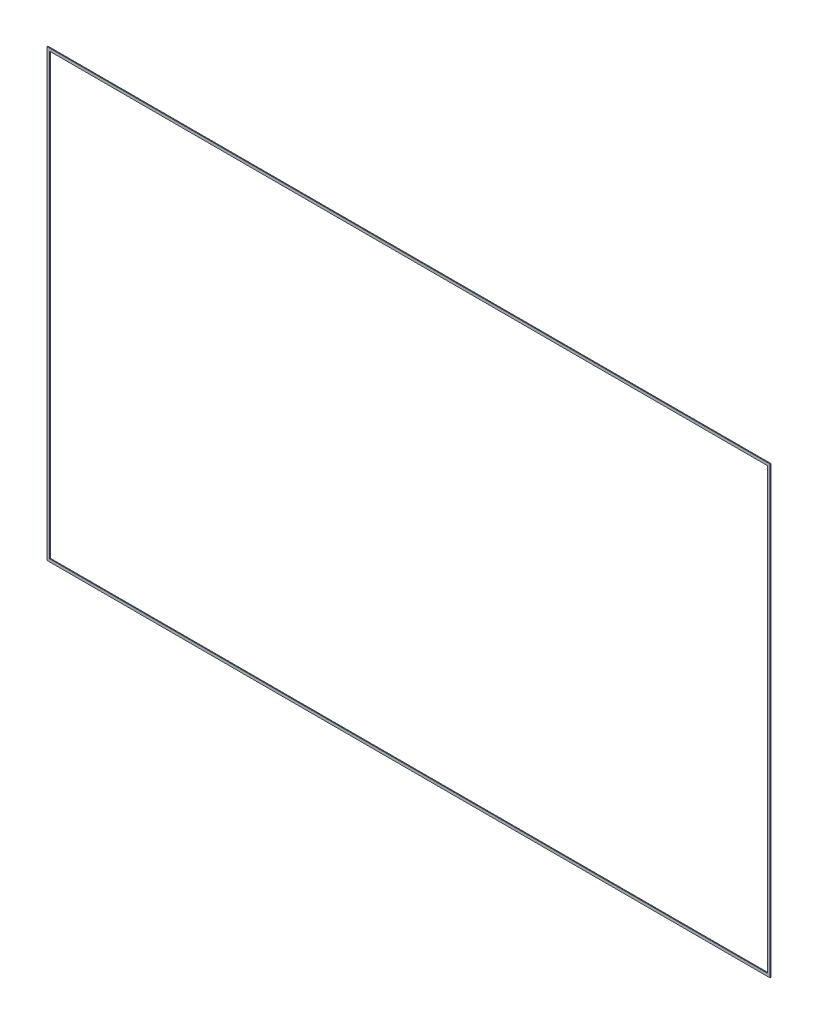
ISO-10303-21;
HEADER;
FILE_DESCRIPTION(('STEP AP214'),'2;1');
FILE_NAME('part.step','',(''),(''),'','','');
FILE_SCHEMA(('AUTOMOTIVE_DESIGN { 1 0 10303 214 1 1 1 1 }'));
ENDSEC;
DATA;
#1=APPLICATION_CONTEXT('core data for automotive mechanical design processes');
#2=APPLICATION_PROTOCOL_DEFINITION('international standard','automotive_design',2000,#1);
#3=PRODUCT_CONTEXT('',#1,'mechanical');
#4=PRODUCT('Part','Part','',(#3));
#5=PRODUCT_RELATED_PRODUCT_CATEGORY('part','',(#4));
#6=PRODUCT_DEFINITION_FORMATION('','',#4);
#7=PRODUCT_DEFINITION_CONTEXT('part definition',#1,'design');
#8=PRODUCT_DEFINITION('design','',#6,#7);
#9=PRODUCT_DEFINITION_SHAPE('','',#8);
#10=(LENGTH_UNIT() NAMED_UNIT(*) SI_UNIT(.MILLI.,.METRE.));
#11=(NAMED_UNIT(*) PLANE_ANGLE_UNIT() SI_UNIT($,.RADIAN.));
#12=(NAMED_UNIT(*) SI_UNIT($,.STERADIAN.) SOLID_ANGLE_UNIT());
#13=UNCERTAINTY_MEASURE_WITH_UNIT(LENGTH_MEASURE(1.E-05),#10,'distance_accuracy_value','');
#14=(GEOMETRIC_REPRESENTATION_CONTEXT(3) GLOBAL_UNCERTAINTY_ASSIGNED_CONTEXT((#13)) GLOBAL_UNIT_ASSIGNED_CONTEXT((#10,
#11,#12)) REPRESENTATION_CONTEXT('',''));
#15=CARTESIAN_POINT('',(0.,0.,0.));
#16=DIRECTION('',(0.,0.,1.));
#17=DIRECTION('',(1.,0.,0.));
#18=AXIS2_PLACEMENT_3D('',#15,#16,#17);
#19=CARTESIAN_POINT('',(0.,0.,0.3));
#20=DIRECTION('',(0.,0.,-1.));
#21=DIRECTION('',(-1.,0.,0.));
#22=AXIS2_PLACEMENT_3D('',#19,#20,#21);
#23=PLANE('',#22);
#24=DIRECTION('',(0.,-1.,0.));
#25=VECTOR('',#24,1.);
#26=CARTESIAN_POINT('',(0.,0.,0.3));
#27=LINE('',#26,#25);
#28=CARTESIAN_POINT('',(0.,160.,0.3));
#29=VERTEX_POINT('',#28);
#30=CARTESIAN_POINT('',(0.,0.,0.3));
#31=VERTEX_POINT('',#30);
#32=EDGE_CURVE('E136',#29,#31,#27,.T.);
#33=ORIENTED_EDGE('',*,*,#32,.T.);
#34=DIRECTION('',(1.,0.,0.));
#35=VECTOR('',#34,1.);
#36=CARTESIAN_POINT('',(0.,0.,0.3));
#37=LINE('',#36,#35);
#38=CARTESIAN_POINT('',(260.,0.,0.3));
#39=VERTEX_POINT('',#38);
#40=EDGE_CURVE('E139',#31,#39,#37,.T.);
#41=ORIENTED_EDGE('',*,*,#40,.T.);
#42=DIRECTION('',(0.,1.,0.));
#43=VECTOR('',#42,1.);
#44=CARTESIAN_POINT('',(260.,0.,0.3));
#45=LINE('',#44,#43);
#46=CARTESIAN_POINT('',(260.,160.,0.3));
#47=VERTEX_POINT('',#46);
#48=EDGE_CURVE('E142',#39,#47,#45,.T.);
#49=ORIENTED_EDGE('',*,*,#48,.T.);
#50=DIRECTION('',(-1.,0.,0.));
#51=VECTOR('',#50,1.);
#52=CARTESIAN_POINT('',(0.,160.,0.3));
#53=LINE('',#52,#51);
#54=EDGE_CURVE('E144',#47,#29,#53,.T.);
#55=ORIENTED_EDGE('',*,*,#54,.T.);
#56=EDGE_LOOP('',(#33,#41,#49,#55));
#57=FACE_BOUND('',#56,.T.);
#58=DIRECTION('',(0.,-1.,0.));
#59=VECTOR('',#58,1.);
#60=CARTESIAN_POINT('',(1.,1.,0.3));
#61=LINE('',#60,#59);
#62=CARTESIAN_POINT('',(1.,159.,0.3));
#63=VERTEX_POINT('',#62);
#64=CARTESIAN_POINT('',(1.,1.,0.3));
#65=VERTEX_POINT('',#64);
#66=EDGE_CURVE('E100',#63,#65,#61,.T.);
#67=ORIENTED_EDGE('',*,*,#66,.F.);
#68=DIRECTION('',(-1.,0.,0.));
#69=VECTOR('',#68,1.);
#70=CARTESIAN_POINT('',(1.,159.,0.3));
#71=LINE('',#70,#69);
#72=CARTESIAN_POINT('',(259.,159.,0.3));
#73=VERTEX_POINT('',#72);
#74=EDGE_CURVE('E122',#73,#63,#71,.T.);
#75=ORIENTED_EDGE('',*,*,#74,.F.);
#76=DIRECTION('',(0.,1.,0.));
#77=VECTOR('',#76,1.);
#78=CARTESIAN_POINT('',(259.,1.,0.3));
#79=LINE('',#78,#77);
#80=CARTESIAN_POINT('',(259.,1.,0.3));
#81=VERTEX_POINT('',#80);
#82=EDGE_CURVE('E120',#81,#73,#79,.T.);
#83=ORIENTED_EDGE('',*,*,#82,.F.);
#84=DIRECTION('',(1.,0.,0.));
#85=VECTOR('',#84,1.);
#86=CARTESIAN_POINT('',(1.,1.,0.3));
#87=LINE('',#86,#85);
#88=EDGE_CURVE('E108',#65,#81,#87,.T.);
#89=ORIENTED_EDGE('',*,*,#88,.F.);
#90=EDGE_LOOP('',(#67,#75,#83,#89));
#91=FACE_BOUND('',#90,.T.);
#92=ADVANCED_FACE('F35',(#57,#91),#23,.F.);
#93=CARTESIAN_POINT('',(0.,0.,0.));
#94=DIRECTION('',(0.,0.,-1.));
#95=DIRECTION('',(-1.,0.,0.));
#96=AXIS2_PLACEMENT_3D('',#93,#94,#95);
#97=PLANE('',#96);
#98=DIRECTION('',(0.,-1.,0.));
#99=VECTOR('',#98,1.);
#100=CARTESIAN_POINT('',(0.,0.,0.));
#101=LINE('',#100,#99);
#102=CARTESIAN_POINT('',(0.,160.,0.));
#103=VERTEX_POINT('',#102);
#104=CARTESIAN_POINT('',(0.,0.,0.));
#105=VERTEX_POINT('',#104);
#106=EDGE_CURVE('E116',#103,#105,#101,.T.);
#107=ORIENTED_EDGE('',*,*,#106,.F.);
#108=DIRECTION('',(-1.,0.,0.));
#109=VECTOR('',#108,1.);
#110=CARTESIAN_POINT('',(0.,160.,0.));
#111=LINE('',#110,#109);
#112=CARTESIAN_POINT('',(260.,160.,0.));
#113=VERTEX_POINT('',#112);
#114=EDGE_CURVE('E140',#113,#103,#111,.T.);
#115=ORIENTED_EDGE('',*,*,#114,.F.);
#116=DIRECTION('',(0.,1.,0.));
#117=VECTOR('',#116,1.);
#118=CARTESIAN_POINT('',(260.,0.,0.));
#119=LINE('',#118,#117);
#120=CARTESIAN_POINT('',(260.,0.,0.));
#121=VERTEX_POINT('',#120);
#122=EDGE_CURVE('E151',#121,#113,#119,.T.);
#123=ORIENTED_EDGE('',*,*,#122,.F.);
#124=DIRECTION('',(1.,0.,0.));
#125=VECTOR('',#124,1.);
#126=CARTESIAN_POINT('',(0.,0.,0.));
#127=LINE('',#126,#125);
#128=EDGE_CURVE('E149',#105,#121,#127,.T.);
#129=ORIENTED_EDGE('',*,*,#128,.F.);
#130=EDGE_LOOP('',(#107,#115,#123,#129));
#131=FACE_BOUND('',#130,.T.);
#132=DIRECTION('',(-1.,0.,0.));
#133=VECTOR('',#132,1.);
#134=CARTESIAN_POINT('',(1.,159.,0.));
#135=LINE('',#134,#133);
#136=CARTESIAN_POINT('',(259.,159.,0.));
#137=VERTEX_POINT('',#136);
#138=CARTESIAN_POINT('',(1.,159.,0.));
#139=VERTEX_POINT('',#138);
#140=EDGE_CURVE('E109',#137,#139,#135,.T.);
#141=ORIENTED_EDGE('',*,*,#140,.T.);
#142=DIRECTION('',(0.,-1.,0.));
#143=VECTOR('',#142,1.);
#144=CARTESIAN_POINT('',(1.,1.,0.));
#145=LINE('',#144,#143);
#146=CARTESIAN_POINT('',(1.,1.,0.));
#147=VERTEX_POINT('',#146);
#148=EDGE_CURVE('E58',#139,#147,#145,.T.);
#149=ORIENTED_EDGE('',*,*,#148,.T.);
#150=DIRECTION('',(1.,0.,0.));
#151=VECTOR('',#150,1.);
#152=CARTESIAN_POINT('',(1.,1.,0.));
#153=LINE('',#152,#151);
#154=CARTESIAN_POINT('',(259.,1.,0.));
#155=VERTEX_POINT('',#154);
#156=EDGE_CURVE('E115',#147,#155,#153,.T.);
#157=ORIENTED_EDGE('',*,*,#156,.T.);
#158=DIRECTION('',(0.,1.,0.));
#159=VECTOR('',#158,1.);
#160=CARTESIAN_POINT('',(259.,1.,0.));
#161=LINE('',#160,#159);
#162=EDGE_CURVE('E128',#155,#137,#161,.T.);
#163=ORIENTED_EDGE('',*,*,#162,.T.);
#164=EDGE_LOOP('',(#141,#149,#157,#163));
#165=FACE_BOUND('',#164,.T.);
#166=ADVANCED_FACE('F169',(#131,#165),#97,.T.);
#167=CARTESIAN_POINT('',(0.,0.,0.3));
#168=DIRECTION('',(1.,0.,0.));
#169=DIRECTION('',(0.,0.,-1.));
#170=AXIS2_PLACEMENT_3D('',#167,#168,#169);
#171=PLANE('',#170);
#172=ORIENTED_EDGE('',*,*,#106,.T.);
#173=DIRECTION('',(0.,0.,-1.));
#174=VECTOR('',#173,1.);
#175=CARTESIAN_POINT('',(0.,0.,0.3));
#176=LINE('',#175,#174);
#177=EDGE_CURVE('E11',#31,#105,#176,.T.);
#178=ORIENTED_EDGE('',*,*,#177,.F.);
#179=ORIENTED_EDGE('',*,*,#32,.F.);
#180=DIRECTION('',(0.,0.,-1.));
#181=VECTOR('',#180,1.);
#182=CARTESIAN_POINT('',(0.,160.,0.3));
#183=LINE('',#182,#181);
#184=EDGE_CURVE('E146',#29,#103,#183,.T.);
#185=ORIENTED_EDGE('',*,*,#184,.T.);
#186=EDGE_LOOP('',(#172,#178,#179,#185));
#187=FACE_BOUND('',#186,.T.);
#188=ADVANCED_FACE('F37',(#187),#171,.F.);
#189=CARTESIAN_POINT('',(0.,0.,0.3));
#190=DIRECTION('',(0.,1.,0.));
#191=DIRECTION('',(0.,0.,1.));
#192=AXIS2_PLACEMENT_3D('',#189,#190,#191);
#193=PLANE('',#192);
#194=ORIENTED_EDGE('',*,*,#128,.T.);
#195=DIRECTION('',(0.,0.,-1.));
#196=VECTOR('',#195,1.);
#197=CARTESIAN_POINT('',(260.,0.,0.3));
#198=LINE('',#197,#196);
#199=EDGE_CURVE('E43',#39,#121,#198,.T.);
#200=ORIENTED_EDGE('',*,*,#199,.F.);
#201=ORIENTED_EDGE('',*,*,#40,.F.);
#202=ORIENTED_EDGE('',*,*,#177,.T.);
#203=EDGE_LOOP('',(#194,#200,#201,#202));
#204=FACE_BOUND('',#203,.T.);
#205=ADVANCED_FACE('F179',(#204),#193,.F.);
#206=CARTESIAN_POINT('',(260.,0.,0.3));
#207=DIRECTION('',(-1.,0.,0.));
#208=DIRECTION('',(0.,0.,1.));
#209=AXIS2_PLACEMENT_3D('',#206,#207,#208);
#210=PLANE('',#209);
#211=ORIENTED_EDGE('',*,*,#122,.T.);
#212=DIRECTION('',(0.,0.,-1.));
#213=VECTOR('',#212,1.);
#214=CARTESIAN_POINT('',(260.,160.,0.3));
#215=LINE('',#214,#213);
#216=EDGE_CURVE('E156',#47,#113,#215,.T.);
#217=ORIENTED_EDGE('',*,*,#216,.F.);
#218=ORIENTED_EDGE('',*,*,#48,.F.);
#219=ORIENTED_EDGE('',*,*,#199,.T.);
#220=EDGE_LOOP('',(#211,#217,#218,#219));
#221=FACE_BOUND('',#220,.T.);
#222=ADVANCED_FACE('F163',(#221),#210,.F.);
#223=CARTESIAN_POINT('',(0.,160.,0.3));
#224=DIRECTION('',(0.,-1.,0.));
#225=DIRECTION('',(0.,0.,-1.));
#226=AXIS2_PLACEMENT_3D('',#223,#224,#225);
#227=PLANE('',#226);
#228=ORIENTED_EDGE('',*,*,#114,.T.);
#229=ORIENTED_EDGE('',*,*,#184,.F.);
#230=ORIENTED_EDGE('',*,*,#54,.F.);
#231=ORIENTED_EDGE('',*,*,#216,.T.);
#232=EDGE_LOOP('',(#228,#229,#230,#231));
#233=FACE_BOUND('',#232,.T.);
#234=ADVANCED_FACE('F173',(#233),#227,.F.);
#235=CARTESIAN_POINT('',(1.,1.,0.3));
#236=DIRECTION('',(1.,0.,0.));
#237=DIRECTION('',(0.,0.,-1.));
#238=AXIS2_PLACEMENT_3D('',#235,#236,#237);
#239=PLANE('',#238);
#240=ORIENTED_EDGE('',*,*,#148,.F.);
#241=DIRECTION('',(0.,0.,-1.));
#242=VECTOR('',#241,1.);
#243=CARTESIAN_POINT('',(1.,159.,0.3));
#244=LINE('',#243,#242);
#245=EDGE_CURVE('E104',#63,#139,#244,.T.);
#246=ORIENTED_EDGE('',*,*,#245,.F.);
#247=ORIENTED_EDGE('',*,*,#66,.T.);
#248=DIRECTION('',(0.,0.,-1.));
#249=VECTOR('',#248,1.);
#250=CARTESIAN_POINT('',(1.,1.,0.3));
#251=LINE('',#250,#249);
#252=EDGE_CURVE('E103',#65,#147,#251,.T.);
#253=ORIENTED_EDGE('',*,*,#252,.T.);
#254=EDGE_LOOP('',(#240,#246,#247,#253));
#255=FACE_BOUND('',#254,.T.);
#256=ADVANCED_FACE('F102',(#255),#239,.T.);
#257=CARTESIAN_POINT('',(1.,1.,0.3));
#258=DIRECTION('',(0.,1.,0.));
#259=DIRECTION('',(0.,0.,1.));
#260=AXIS2_PLACEMENT_3D('',#257,#258,#259);
#261=PLANE('',#260);
#262=ORIENTED_EDGE('',*,*,#156,.F.);
#263=ORIENTED_EDGE('',*,*,#252,.F.);
#264=ORIENTED_EDGE('',*,*,#88,.T.);
#265=DIRECTION('',(0.,0.,-1.));
#266=VECTOR('',#265,1.);
#267=CARTESIAN_POINT('',(259.,1.,0.3));
#268=LINE('',#267,#266);
#269=EDGE_CURVE('E117',#81,#155,#268,.T.);
#270=ORIENTED_EDGE('',*,*,#269,.T.);
#271=EDGE_LOOP('',(#262,#263,#264,#270));
#272=FACE_BOUND('',#271,.T.);
#273=ADVANCED_FACE('F112',(#272),#261,.T.);
#274=CARTESIAN_POINT('',(259.,1.,0.3));
#275=DIRECTION('',(-1.,0.,0.));
#276=DIRECTION('',(0.,0.,1.));
#277=AXIS2_PLACEMENT_3D('',#274,#275,#276);
#278=PLANE('',#277);
#279=ORIENTED_EDGE('',*,*,#162,.F.);
#280=ORIENTED_EDGE('',*,*,#269,.F.);
#281=ORIENTED_EDGE('',*,*,#82,.T.);
#282=DIRECTION('',(0.,0.,-1.));
#283=VECTOR('',#282,1.);
#284=CARTESIAN_POINT('',(259.,159.,0.3));
#285=LINE('',#284,#283);
#286=EDGE_CURVE('E50',#73,#137,#285,.T.);
#287=ORIENTED_EDGE('',*,*,#286,.T.);
#288=EDGE_LOOP('',(#279,#280,#281,#287));
#289=FACE_BOUND('',#288,.T.);
#290=ADVANCED_FACE('F202',(#289),#278,.T.);
#291=CARTESIAN_POINT('',(1.,159.,0.3));
#292=DIRECTION('',(0.,-1.,0.));
#293=DIRECTION('',(0.,0.,-1.));
#294=AXIS2_PLACEMENT_3D('',#291,#292,#293);
#295=PLANE('',#294);
#296=ORIENTED_EDGE('',*,*,#140,.F.);
#297=ORIENTED_EDGE('',*,*,#286,.F.);
#298=ORIENTED_EDGE('',*,*,#74,.T.);
#299=ORIENTED_EDGE('',*,*,#245,.T.);
#300=EDGE_LOOP('',(#296,#297,#298,#299));
#301=FACE_BOUND('',#300,.T.);
#302=ADVANCED_FACE('F206',(#301),#295,.T.);
#303=CLOSED_SHELL('',(#92,#166,#188,#205,#222,#234,#256,#273,#290,#302));
#304=MANIFOLD_SOLID_BREP('B2',#303);
#305=ADVANCED_BREP_SHAPE_REPRESENTATION('',(#18,#304),#14);
#306=SHAPE_DEFINITION_REPRESENTATION(#9,#305);
ENDSEC;
END-ISO-10303-21;
